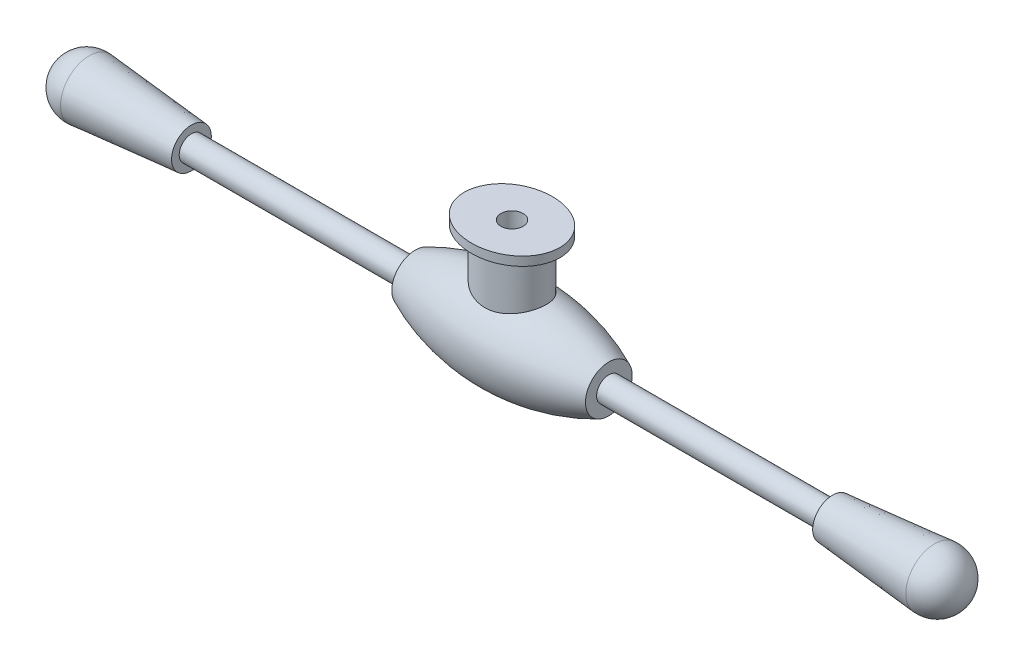
ISO-10303-21;
HEADER;
FILE_DESCRIPTION(('STEP AP214'),'2;1');
FILE_NAME('part.step','',(''),(''),'','','');
FILE_SCHEMA(('AUTOMOTIVE_DESIGN { 1 0 10303 214 1 1 1 1 }'));
ENDSEC;
DATA;
#1=APPLICATION_CONTEXT('core data for automotive mechanical design processes');
#2=APPLICATION_PROTOCOL_DEFINITION('international standard','automotive_design',2000,#1);
#3=PRODUCT_CONTEXT('',#1,'mechanical');
#4=PRODUCT('Part','Part','',(#3));
#5=PRODUCT_RELATED_PRODUCT_CATEGORY('part','',(#4));
#6=PRODUCT_DEFINITION_FORMATION('','',#4);
#7=PRODUCT_DEFINITION_CONTEXT('part definition',#1,'design');
#8=PRODUCT_DEFINITION('design','',#6,#7);
#9=PRODUCT_DEFINITION_SHAPE('','',#8);
#10=(LENGTH_UNIT() NAMED_UNIT(*) SI_UNIT(.MILLI.,.METRE.));
#11=(NAMED_UNIT(*) PLANE_ANGLE_UNIT() SI_UNIT($,.RADIAN.));
#12=(NAMED_UNIT(*) SI_UNIT($,.STERADIAN.) SOLID_ANGLE_UNIT());
#13=UNCERTAINTY_MEASURE_WITH_UNIT(LENGTH_MEASURE(1.E-05),#10,'distance_accuracy_value','');
#14=(GEOMETRIC_REPRESENTATION_CONTEXT(3) GLOBAL_UNCERTAINTY_ASSIGNED_CONTEXT((#13)) GLOBAL_UNIT_ASSIGNED_CONTEXT((#10,
#11,#12)) REPRESENTATION_CONTEXT('',''));
#15=CARTESIAN_POINT('',(0.,0.,0.));
#16=DIRECTION('',(0.,0.,1.));
#17=DIRECTION('',(1.,0.,0.));
#18=AXIS2_PLACEMENT_3D('',#15,#16,#17);
#19=CARTESIAN_POINT('',(0.,0.,0.));
#20=DIRECTION('',(1.,0.,0.));
#21=DIRECTION('',(0.,0.,-1.));
#22=AXIS2_PLACEMENT_3D('',#19,#20,#21);
#23=DEGENERATE_TOROIDAL_SURFACE('',#22,10.7114473684211,13.2514473684211,.F.);
#24=CARTESIAN_POINT('',(5.5245,0.,0.));
#25=DIRECTION('',(1.,0.,0.));
#26=DIRECTION('',(0.,0.,-1.));
#27=AXIS2_PLACEMENT_3D('',#24,#25,#26);
#28=CIRCLE('',#27,1.3335);
#29=CARTESIAN_POINT('',(5.5245,0.,-1.3335));
#30=VERTEX_POINT('',#29);
#31=EDGE_CURVE('E75',#30,#30,#28,.T.);
#32=ORIENTED_EDGE('',*,*,#31,.F.);
#33=EDGE_LOOP('',(#32));
#34=FACE_BOUND('',#33,.T.);
#35=CARTESIAN_POINT('',(-5.52449999999999,0.,0.));
#36=DIRECTION('',(1.,0.,0.));
#37=DIRECTION('',(0.,0.,-1.));
#38=AXIS2_PLACEMENT_3D('',#35,#36,#37);
#39=CIRCLE('',#38,1.3335);
#40=CARTESIAN_POINT('',(-5.52449999999999,0.,-1.3335));
#41=VERTEX_POINT('',#40);
#42=EDGE_CURVE('E79',#41,#41,#39,.T.);
#43=ORIENTED_EDGE('',*,*,#42,.T.);
#44=EDGE_LOOP('',(#43));
#45=FACE_BOUND('',#44,.T.);
#46=CARTESIAN_POINT('',(-1.9685,2.39297421774724,0.));
#47=CARTESIAN_POINT('',(-1.96849995980044,2.39297421058853,-0.0337278544221725));
#48=CARTESIAN_POINT('',(-1.96708617457117,2.39247147451063,-0.0674542473270021));
#49=CARTESIAN_POINT('',(-1.9614622226903,2.39047700589575,-0.134651485480599));
#50=CARTESIAN_POINT('',(-1.95725077653958,2.38898482083879,-0.168122206711003));
#51=CARTESIAN_POINT('',(-1.94052433260572,2.38308004571611,-0.267693577728864));
#52=CARTESIAN_POINT('',(-1.92391688537091,2.37723904322142,-0.333064814808142));
#53=CARTESIAN_POINT('',(-1.88083429926706,2.36232574891557,-0.460093884173333));
#54=CARTESIAN_POINT('',(-1.85434705873547,2.35324949488378,-0.521747054199997));
#55=CARTESIAN_POINT('',(-1.80451649271205,2.33655098539994,-0.617868253374601));
#56=CARTESIAN_POINT('',(-1.78374283474482,2.32966747079554,-0.653833471700946));
#57=CARTESIAN_POINT('',(-1.73928284787085,2.31516648202458,-0.723697717656109));
#58=CARTESIAN_POINT('',(-1.71559972000976,2.30754981644551,-0.757598955746229));
#59=CARTESIAN_POINT('',(-1.64068060105917,2.28389791576877,-0.85605557486414));
#60=CARTESIAN_POINT('',(-1.58552333194977,2.26704304517566,-0.917460570107732));
#61=CARTESIAN_POINT('',(-1.45037099355761,2.22778457308915,-1.04754339518927));
#62=CARTESIAN_POINT('',(-1.36775487423683,2.20515462463453,-1.1134026377673));
#63=CARTESIAN_POINT('',(-1.19279776060712,2.16139053839802,-1.23082233100203));
#64=CARTESIAN_POINT('',(-1.10046425477075,2.14025526947645,-1.28239368254845));
#65=CARTESIAN_POINT('',(-0.908661709954638,2.10163845169362,-1.37160656846143));
#66=CARTESIAN_POINT('',(-0.809195163724849,2.08415563470481,-1.409252941076));
#67=CARTESIAN_POINT('',(-0.60534123534552,2.05462189093183,-1.47077217832697));
#68=CARTESIAN_POINT('',(-0.500954369603968,2.04257039550386,-1.49464648493255));
#69=CARTESIAN_POINT('',(-0.289413284786048,2.02518077418633,-1.52862585543664));
#70=CARTESIAN_POINT('',(-0.182259060096245,2.01984266191559,-1.53873089140271));
#71=CARTESIAN_POINT('',(0.0325779326380007,2.01647484362719,-1.54513789943809));
#72=CARTESIAN_POINT('',(0.140260706193717,2.01844521397875,-1.54143972727224));
#73=CARTESIAN_POINT('',(0.35388821004992,2.02947262732526,-1.52025489671307));
#74=CARTESIAN_POINT('',(0.459832964404956,2.03852957215591,-1.50276842931728));
#75=CARTESIAN_POINT('',(0.667791079667733,2.06274192839537,-1.45403951626892));
#76=CARTESIAN_POINT('',(0.769804400440387,2.07789740204456,-1.42279693022378));
#77=CARTESIAN_POINT('',(0.967746347693821,2.1127364411216,-1.34648578426735));
#78=CARTESIAN_POINT('',(1.06367410799358,2.13242064930498,-1.30141526147754));
#79=CARTESIAN_POINT('',(1.24707678766415,2.17432584773466,-1.19720333452113));
#80=CARTESIAN_POINT('',(1.33454816629509,2.19654789216715,-1.13805607190981));
#81=CARTESIAN_POINT('',(1.48986341163242,2.23892181484122,-1.01192490527504));
#82=CARTESIAN_POINT('',(1.55879331683017,2.2590606163801,-0.946298416859666));
#83=CARTESIAN_POINT('',(1.64878029355964,2.28652884030143,-0.84383298751635));
#84=CARTESIAN_POINT('',(1.6749232430916,2.29468063529952,-0.81161532943599));
#85=CARTESIAN_POINT('',(1.72456024576486,2.31041879986245,-0.745011304544688));
#86=CARTESIAN_POINT('',(1.74805136651575,2.31800454040387,-0.710622601237624));
#87=CARTESIAN_POINT('',(1.80959790026821,2.33815446125873,-0.611472681513492));
#88=CARTESIAN_POINT('',(1.84430479339947,2.34985720449234,-0.544385451815942));
#89=CARTESIAN_POINT('',(1.90187973674695,2.3695522043993,-0.404736465295441));
#90=CARTESIAN_POINT('',(1.92474769516554,2.37754443230173,-0.332174666028354));
#91=CARTESIAN_POINT('',(1.95622855946788,2.38860856868364,-0.186607663925417));
#92=CARTESIAN_POINT('',(1.96536545321113,2.39186118607454,-0.113731506126564));
#93=CARTESIAN_POINT('',(1.9702705036607,2.39360274544966,0.0325010316148176));
#94=CARTESIAN_POINT('',(1.96604690939953,2.39209462680872,0.105857087346386));
#95=CARTESIAN_POINT('',(1.94588692970215,2.38497038725859,0.24193251393269));
#96=CARTESIAN_POINT('',(1.93136967206009,2.37985235622239,0.30489683958973));
#97=CARTESIAN_POINT('',(1.89312125756686,2.36655946129577,0.427608720305662));
#98=CARTESIAN_POINT('',(1.86938722268862,2.35838364261131,0.487355263939065));
#99=CARTESIAN_POINT('',(1.81207365883933,2.33903097360992,0.606374436448141));
#100=CARTESIAN_POINT('',(1.77794646075441,2.32769131068239,0.665353968595428));
#101=CARTESIAN_POINT('',(1.70205151135505,2.30317638699397,0.777816804949466));
#102=CARTESIAN_POINT('',(1.66027341276463,2.28999864619212,0.831292510773751));
#103=CARTESIAN_POINT('',(1.58209249846986,2.26620589678867,0.919293969395882));
#104=CARTESIAN_POINT('',(1.54709200377991,2.25580902097377,0.955144851009291));
#105=CARTESIAN_POINT('',(1.47415568921129,2.23480256002684,1.0235714551123));
#106=CARTESIAN_POINT('',(1.43622236230663,2.22419316110691,1.05614990623571));
#107=CARTESIAN_POINT('',(1.31864879606383,2.19248893767847,1.14898641036101));
#108=CARTESIAN_POINT('',(1.2351410649133,2.17148857013986,1.20444870921247));
#109=CARTESIAN_POINT('',(1.05973442490906,2.13164156165052,1.30314419132101));
#110=CARTESIAN_POINT('',(0.967762886387117,2.11281744545305,1.34625531301705));
#111=CARTESIAN_POINT('',(0.778147083365579,2.07929107415576,1.41979502293557));
#112=CARTESIAN_POINT('',(0.680500554224173,2.06459047839819,1.45021850792751));
#113=CARTESIAN_POINT('',(0.46413693521431,2.0386623847649,1.50260369839061));
#114=CARTESIAN_POINT('',(0.344706977402078,2.02848232485811,1.52217629174266));
#115=CARTESIAN_POINT('',(0.103858323381694,2.01719013510593,1.54382737309018));
#116=CARTESIAN_POINT('',(-0.0175604128861463,2.01607818814389,1.54590550826195));
#117=CARTESIAN_POINT('',(-0.259162659517986,2.02307554346959,1.53256180739249));
#118=CARTESIAN_POINT('',(-0.379346180844733,2.03118476384642,1.51714012680075));
#119=CARTESIAN_POINT('',(-0.615308988387039,2.05549333018357,1.46884551695306));
#120=CARTESIAN_POINT('',(-0.731088285435693,2.07169265624323,1.43597263062492));
#121=CARTESIAN_POINT('',(-0.953383069651349,2.10973191294305,1.3533888431375));
#122=CARTESIAN_POINT('',(-1.06001565744238,2.13147907744007,1.30395102841176));
#123=CARTESIAN_POINT('',(-1.25434986297333,2.176090750289,1.19262507367203));
#124=CARTESIAN_POINT('',(-1.34288886814806,2.19870981878752,1.13212347340611));
#125=CARTESIAN_POINT('',(-1.4616451412769,2.23128288002586,1.03440077451665));
#126=CARTESIAN_POINT('',(-1.49679189830328,2.24124688113069,1.00307758986892));
#127=CARTESIAN_POINT('',(-1.56443808163149,2.26094316359785,0.937512111494816));
#128=CARTESIAN_POINT('',(-1.59693322928243,2.27067505319323,0.903265275461994));
#129=CARTESIAN_POINT('',(-1.68283484419029,2.2969819281395,0.804226705737639));
#130=CARTESIAN_POINT('',(-1.73292617303056,2.31301397371661,0.736335252921858));
#131=CARTESIAN_POINT('',(-1.82054738856252,2.34178451280391,0.592272833225591));
#132=CARTESIAN_POINT('',(-1.85810551860787,2.35453039666994,0.516121001625509));
#133=CARTESIAN_POINT('',(-1.90079714341745,2.36922500597419,0.402782149903723));
#134=CARTESIAN_POINT('',(-1.91220657549659,2.37318572814373,0.368142876559502));
#135=CARTESIAN_POINT('',(-1.93200530247289,2.38009347690439,0.297918720549169));
#136=CARTESIAN_POINT('',(-1.94039610959524,2.38304101103413,0.26233432097957));
#137=CARTESIAN_POINT('',(-1.95424230983003,2.38791966931344,0.189166881253103));
#138=CARTESIAN_POINT('',(-1.95957850867997,2.38980946460466,0.151558447490957));
#139=CARTESIAN_POINT('',(-1.96670720985882,2.39233668399539,0.0759660342403854));
#140=CARTESIAN_POINT('',(-1.9685000452701,2.3929742258089,0.037982090387948));
#141=CARTESIAN_POINT('',(-1.9685,2.39297421774724,0.));
#142=B_SPLINE_CURVE_WITH_KNOTS('',3,(#46,#47,#48,#49,#50,#51,#52,#53,#54,#55,#56,#57,#58,#59,
#60,#61,#62,#63,#64,#65,#66,#67,#68,#69,#70,#71,#72,#73,#74,#75,#76,#77,#78,#79,#80,#81,#82,#83,
#84,#85,#86,#87,#88,#89,#90,#91,#92,#93,#94,#95,#96,#97,#98,#99,#100,#101,#102,#103,#104,#105,
#106,#107,#108,#109,#110,#111,#112,#113,#114,#115,#116,#117,#118,#119,#120,#121,#122,#123,#124,
#125,#126,#127,#128,#129,#130,#131,#132,#133,#134,#135,#136,#137,#138,#139,#140,#141),
.UNSPECIFIED.,.T.,.F.,(4,2,2,2,2,2,2,2,2,2,2,2,2,2,2,2,2,2,2,2,2,2,2,2,2,2,2,2,2,2,2,2,2,2,2,2,
2,2,2,2,2,2,2,2,2,2,2,4),(0.,0.101144597303681,0.202335484563735,0.404387732531978,
0.606688289432301,0.732838033599904,0.858850208308876,1.11054572335763,1.43309371226908,
1.75539493251455,2.07758406344989,2.3997394542653,2.72189549860651,3.0440549092926,
3.36620985745695,3.6883680935552,4.01057208125717,4.33291039873565,4.62330613569295,
4.75003469826162,4.87690205215277,5.10507362816147,5.33324697335782,5.5524698880465,
5.77155747654751,5.96516857559904,6.15884018024879,6.3653302561279,6.57210168502626,
6.72542110531561,6.87861160392512,7.18457018179873,7.49345561876541,7.80246517631098,
8.16517198613238,8.52788611091326,8.89059701375828,9.25330702438354,9.61030976732246,
9.93746408861283,10.0816940635811,10.226152346887,10.4825854775312,10.7384367753385,
10.8483675424376,10.9582431611382,11.072156259939,11.1860586501994),.UNSPECIFIED.);
#143=CARTESIAN_POINT('',(-1.9685,2.39297421774724,0.));
#144=VERTEX_POINT('',#143);
#145=EDGE_CURVE('E50',#144,#144,#142,.T.);
#146=ORIENTED_EDGE('',*,*,#145,.T.);
#147=EDGE_LOOP('',(#146));
#148=FACE_BOUND('',#147,.T.);
#149=ADVANCED_FACE('F46',(#34,#45,#148),#23,.F.);
#150=CARTESIAN_POINT('',(-24.257,0.,0.));
#151=DIRECTION('',(1.,0.,0.));
#152=DIRECTION('',(0.,0.,-1.));
#153=AXIS2_PLACEMENT_3D('',#150,#151,#152);
#154=SPHERICAL_SURFACE('',#153,1.651);
#155=CARTESIAN_POINT('',(-24.1131058687236,0.,0.));
#156=DIRECTION('',(1.,0.,0.));
#157=DIRECTION('',(0.,0.,-1.));
#158=AXIS2_PLACEMENT_3D('',#155,#156,#157);
#159=CIRCLE('',#158,1.64471744654947);
#160=CARTESIAN_POINT('',(-24.1131058687236,0.,-1.64471744654947));
#161=VERTEX_POINT('',#160);
#162=EDGE_CURVE('E93',#161,#161,#159,.T.);
#163=ORIENTED_EDGE('',*,*,#162,.F.);
#164=EDGE_LOOP('',(#163));
#165=FACE_BOUND('',#164,.T.);
#166=ADVANCED_FACE('F48',(#165),#154,.T.);
#167=CARTESIAN_POINT('',(24.257,0.,0.));
#168=DIRECTION('',(1.,0.,0.));
#169=DIRECTION('',(0.,0.,1.));
#170=AXIS2_PLACEMENT_3D('',#167,#168,#169);
#171=SPHERICAL_SURFACE('',#170,1.651);
#172=CARTESIAN_POINT('',(24.1131058687236,0.,0.));
#173=DIRECTION('',(1.,0.,0.));
#174=DIRECTION('',(0.,0.,-1.));
#175=AXIS2_PLACEMENT_3D('',#172,#173,#174);
#176=CIRCLE('',#175,1.64471744654948);
#177=CARTESIAN_POINT('',(24.1131058687236,0.,-1.64471744654948));
#178=VERTEX_POINT('',#177);
#179=EDGE_CURVE('E10',#178,#178,#176,.T.);
#180=ORIENTED_EDGE('',*,*,#179,.T.);
#181=EDGE_LOOP('',(#180));
#182=FACE_BOUND('',#181,.T.);
#183=ADVANCED_FACE('F147',(#182),#171,.T.);
#184=CARTESIAN_POINT('',(24.1131058687236,0.,0.));
#185=DIRECTION('',(1.,0.,0.));
#186=DIRECTION('',(0.,0.,-1.));
#187=AXIS2_PLACEMENT_3D('',#184,#185,#186);
#188=CONICAL_SURFACE('',#187,1.64471744654948,0.0872664625997167);
#189=CARTESIAN_POINT('',(18.288,0.,0.));
#190=DIRECTION('',(1.,0.,0.));
#191=DIRECTION('',(0.,0.,-1.));
#192=AXIS2_PLACEMENT_3D('',#189,#190,#191);
#193=CIRCLE('',#192,1.13508671919783);
#194=CARTESIAN_POINT('',(18.288,0.,-1.13508671919783));
#195=VERTEX_POINT('',#194);
#196=EDGE_CURVE('E60',#195,#195,#193,.T.);
#197=ORIENTED_EDGE('',*,*,#196,.T.);
#198=EDGE_LOOP('',(#197));
#199=FACE_BOUND('',#198,.T.);
#200=ORIENTED_EDGE('',*,*,#179,.F.);
#201=EDGE_LOOP('',(#200));
#202=FACE_BOUND('',#201,.T.);
#203=ADVANCED_FACE('F144',(#199,#202),#188,.T.);
#204=CARTESIAN_POINT('',(18.288,0.,-1.13508671919783));
#205=DIRECTION('',(-1.,0.,0.));
#206=DIRECTION('',(0.,0.,1.));
#207=AXIS2_PLACEMENT_3D('',#204,#205,#206);
#208=PLANE('',#207);
#209=CARTESIAN_POINT('',(18.288,0.,0.));
#210=DIRECTION('',(1.,0.,0.));
#211=DIRECTION('',(0.,0.,-1.));
#212=AXIS2_PLACEMENT_3D('',#209,#210,#211);
#213=CIRCLE('',#212,0.698500000000004);
#214=CARTESIAN_POINT('',(18.288,0.,-0.698500000000004));
#215=VERTEX_POINT('',#214);
#216=EDGE_CURVE('E66',#215,#215,#213,.T.);
#217=ORIENTED_EDGE('',*,*,#216,.T.);
#218=EDGE_LOOP('',(#217));
#219=FACE_BOUND('',#218,.T.);
#220=ORIENTED_EDGE('',*,*,#196,.F.);
#221=EDGE_LOOP('',(#220));
#222=FACE_BOUND('',#221,.T.);
#223=ADVANCED_FACE('F140',(#219,#222),#208,.T.);
#224=CARTESIAN_POINT('',(25.908,0.,0.));
#225=DIRECTION('',(1.,0.,0.));
#226=DIRECTION('',(0.,0.,-1.));
#227=AXIS2_PLACEMENT_3D('',#224,#225,#226);
#228=CYLINDRICAL_SURFACE('',#227,0.698500000000004);
#229=CARTESIAN_POINT('',(5.5245,0.,0.));
#230=DIRECTION('',(1.,0.,0.));
#231=DIRECTION('',(0.,0.,-1.));
#232=AXIS2_PLACEMENT_3D('',#229,#230,#231);
#233=CIRCLE('',#232,0.698500000000003);
#234=CARTESIAN_POINT('',(5.5245,0.,-0.698500000000003));
#235=VERTEX_POINT('',#234);
#236=EDGE_CURVE('E71',#235,#235,#233,.T.);
#237=ORIENTED_EDGE('',*,*,#236,.T.);
#238=EDGE_LOOP('',(#237));
#239=FACE_BOUND('',#238,.T.);
#240=ORIENTED_EDGE('',*,*,#216,.F.);
#241=EDGE_LOOP('',(#240));
#242=FACE_BOUND('',#241,.T.);
#243=ADVANCED_FACE('F136',(#239,#242),#228,.T.);
#244=CARTESIAN_POINT('',(5.5245,0.,-0.698500000000003));
#245=DIRECTION('',(1.,0.,0.));
#246=DIRECTION('',(0.,0.,-1.));
#247=AXIS2_PLACEMENT_3D('',#244,#245,#246);
#248=PLANE('',#247);
#249=ORIENTED_EDGE('',*,*,#31,.T.);
#250=EDGE_LOOP('',(#249));
#251=FACE_BOUND('',#250,.T.);
#252=ORIENTED_EDGE('',*,*,#236,.F.);
#253=EDGE_LOOP('',(#252));
#254=FACE_BOUND('',#253,.T.);
#255=ADVANCED_FACE('F128',(#251,#254),#248,.T.);
#256=CARTESIAN_POINT('',(-5.5245,0.,-0.698500000000002));
#257=DIRECTION('',(-1.,0.,0.));
#258=DIRECTION('',(0.,0.,1.));
#259=AXIS2_PLACEMENT_3D('',#256,#257,#258);
#260=PLANE('',#259);
#261=CARTESIAN_POINT('',(-5.5245,0.,0.));
#262=DIRECTION('',(1.,0.,0.));
#263=DIRECTION('',(0.,0.,-1.));
#264=AXIS2_PLACEMENT_3D('',#261,#262,#263);
#265=CIRCLE('',#264,0.698500000000002);
#266=CARTESIAN_POINT('',(-5.5245,0.,-0.698500000000002));
#267=VERTEX_POINT('',#266);
#268=EDGE_CURVE('E83',#267,#267,#265,.T.);
#269=ORIENTED_EDGE('',*,*,#268,.T.);
#270=EDGE_LOOP('',(#269));
#271=FACE_BOUND('',#270,.T.);
#272=ORIENTED_EDGE('',*,*,#42,.F.);
#273=EDGE_LOOP('',(#272));
#274=FACE_BOUND('',#273,.T.);
#275=ADVANCED_FACE('F125',(#271,#274),#260,.T.);
#276=CARTESIAN_POINT('',(25.908,0.,0.));
#277=DIRECTION('',(1.,0.,0.));
#278=DIRECTION('',(0.,0.,-1.));
#279=AXIS2_PLACEMENT_3D('',#276,#277,#278);
#280=CYLINDRICAL_SURFACE('',#279,0.698500000000001);
#281=CARTESIAN_POINT('',(-18.288,0.,0.));
#282=DIRECTION('',(1.,0.,0.));
#283=DIRECTION('',(0.,0.,-1.));
#284=AXIS2_PLACEMENT_3D('',#281,#282,#283);
#285=CIRCLE('',#284,0.6985);
#286=CARTESIAN_POINT('',(-18.288,0.,-0.6985));
#287=VERTEX_POINT('',#286);
#288=EDGE_CURVE('E87',#287,#287,#285,.T.);
#289=ORIENTED_EDGE('',*,*,#288,.T.);
#290=EDGE_LOOP('',(#289));
#291=FACE_BOUND('',#290,.T.);
#292=ORIENTED_EDGE('',*,*,#268,.F.);
#293=EDGE_LOOP('',(#292));
#294=FACE_BOUND('',#293,.T.);
#295=ADVANCED_FACE('F121',(#291,#294),#280,.T.);
#296=CARTESIAN_POINT('',(-18.288,0.,-1.13508671919783));
#297=DIRECTION('',(1.,0.,0.));
#298=DIRECTION('',(0.,0.,-1.));
#299=AXIS2_PLACEMENT_3D('',#296,#297,#298);
#300=PLANE('',#299);
#301=CARTESIAN_POINT('',(-18.288,0.,0.));
#302=DIRECTION('',(1.,0.,0.));
#303=DIRECTION('',(0.,0.,-1.));
#304=AXIS2_PLACEMENT_3D('',#301,#302,#303);
#305=CIRCLE('',#304,1.13508671919783);
#306=CARTESIAN_POINT('',(-18.288,0.,-1.13508671919783));
#307=VERTEX_POINT('',#306);
#308=EDGE_CURVE('E90',#307,#307,#305,.T.);
#309=ORIENTED_EDGE('',*,*,#308,.T.);
#310=EDGE_LOOP('',(#309));
#311=FACE_BOUND('',#310,.T.);
#312=ORIENTED_EDGE('',*,*,#288,.F.);
#313=EDGE_LOOP('',(#312));
#314=FACE_BOUND('',#313,.T.);
#315=ADVANCED_FACE('F117',(#311,#314),#300,.T.);
#316=CARTESIAN_POINT('',(-18.288,0.,0.));
#317=DIRECTION('',(-1.,0.,0.));
#318=DIRECTION('',(0.,0.,1.));
#319=AXIS2_PLACEMENT_3D('',#316,#317,#318);
#320=CONICAL_SURFACE('',#319,1.13508671919783,0.0872664625997165);
#321=ORIENTED_EDGE('',*,*,#162,.T.);
#322=EDGE_LOOP('',(#321));
#323=FACE_BOUND('',#322,.T.);
#324=ORIENTED_EDGE('',*,*,#308,.F.);
#325=EDGE_LOOP('',(#324));
#326=FACE_BOUND('',#325,.T.);
#327=ADVANCED_FACE('F112',(#323,#326),#320,.T.);
#328=CARTESIAN_POINT('',(0.,5.08,0.));
#329=DIRECTION('',(0.,1.,0.));
#330=DIRECTION('',(-1.,0.,0.));
#331=AXIS2_PLACEMENT_3D('',#328,#329,#330);
#332=ELLIPSE('',#331,1.9685,1.54305);
#333=DIRECTION('',(0.,-1.,0.));
#334=VECTOR('',#333,1.);
#335=SURFACE_OF_LINEAR_EXTRUSION('',#332,#334);
#336=ORIENTED_EDGE('',*,*,#145,.F.);
#337=EDGE_LOOP('',(#336));
#338=FACE_BOUND('',#337,.T.);
#339=CARTESIAN_POINT('',(-1.9685,5.08,0.));
#340=VERTEX_POINT('',#339);
#341=EDGE_CURVE('E96',#340,#340,#332,.T.);
#342=ORIENTED_EDGE('',*,*,#341,.F.);
#343=EDGE_LOOP('',(#342));
#344=FACE_BOUND('',#343,.T.);
#345=ADVANCED_FACE('F106',(#338,#344),#335,.F.);
#346=CARTESIAN_POINT('',(-2.7305,5.588,0.));
#347=CARTESIAN_POINT('',(-2.7305,5.588,0.328264154945126));
#348=CARTESIAN_POINT('',(-2.5592940626462,5.588,0.984792464835377));
#349=CARTESIAN_POINT('',(-1.68156315501589,5.588,1.99157673247306));
#350=CARTESIAN_POINT('',(0.,5.588,2.51403217835129));
#351=CARTESIAN_POINT('',(1.68156315501589,5.588,1.99157673247306));
#352=CARTESIAN_POINT('',(2.5592940626462,5.588,0.984792464835377));
#353=CARTESIAN_POINT('',(2.8161029686769,5.588,0.));
#354=CARTESIAN_POINT('',(2.5592940626462,5.588,-0.984792464835377));
#355=CARTESIAN_POINT('',(1.68156315501589,5.588,-1.99157673247306));
#356=CARTESIAN_POINT('',(0.,5.588,-2.51403217835129));
#357=CARTESIAN_POINT('',(-1.68156315501589,5.588,-1.99157673247306));
#358=CARTESIAN_POINT('',(-2.5592940626462,5.588,-0.984792464835379));
#359=CARTESIAN_POINT('',(-2.7305,5.588,-0.328264154945127));
#360=CARTESIAN_POINT('',(-2.7305,5.588,0.));
#361=B_SPLINE_CURVE_WITH_KNOTS('',3,(#346,#347,#348,#349,#350,#351,#352,#353,#354,#355,#356,
#357,#358,#359,#360),.UNSPECIFIED.,.T.,.F.,(4,1,1,1,1,1,1,1,1,1,1,1,4),(0.,0.392699081698724,
0.785398163397448,1.5707963267949,2.35619449019234,2.74889357189107,3.14159265358979,
3.53429173528852,3.92699081698724,4.71238898038469,5.49778714378214,5.89048622548086,
6.28318530717959),.UNSPECIFIED.);
#362=DIRECTION('',(0.,-1.,0.));
#363=VECTOR('',#362,1.);
#364=SURFACE_OF_LINEAR_EXTRUSION('',#361,#363);
#365=CARTESIAN_POINT('',(-2.7305,5.588,0.));
#366=VERTEX_POINT('',#365);
#367=EDGE_CURVE('E101',#366,#366,#361,.T.);
#368=ORIENTED_EDGE('',*,*,#367,.F.);
#369=EDGE_LOOP('',(#368));
#370=FACE_BOUND('',#369,.T.);
#371=CARTESIAN_POINT('',(-2.7305,5.08,0.));
#372=CARTESIAN_POINT('',(-2.7305,5.08,0.328264154945126));
#373=CARTESIAN_POINT('',(-2.5592940626462,5.08,0.984792464835377));
#374=CARTESIAN_POINT('',(-1.68156315501589,5.08,1.99157673247306));
#375=CARTESIAN_POINT('',(0.,5.08,2.51403217835129));
#376=CARTESIAN_POINT('',(1.68156315501589,5.08,1.99157673247306));
#377=CARTESIAN_POINT('',(2.5592940626462,5.08,0.984792464835377));
#378=CARTESIAN_POINT('',(2.8161029686769,5.08,0.));
#379=CARTESIAN_POINT('',(2.5592940626462,5.08,-0.984792464835377));
#380=CARTESIAN_POINT('',(1.68156315501589,5.08,-1.99157673247306));
#381=CARTESIAN_POINT('',(0.,5.08,-2.51403217835129));
#382=CARTESIAN_POINT('',(-1.68156315501589,5.08,-1.99157673247306));
#383=CARTESIAN_POINT('',(-2.5592940626462,5.08,-0.984792464835379));
#384=CARTESIAN_POINT('',(-2.7305,5.08,-0.328264154945127));
#385=CARTESIAN_POINT('',(-2.7305,5.08,0.));
#386=B_SPLINE_CURVE_WITH_KNOTS('',3,(#371,#372,#373,#374,#375,#376,#377,#378,#379,#380,#381,
#382,#383,#384,#385),.UNSPECIFIED.,.T.,.F.,(4,1,1,1,1,1,1,1,1,1,1,1,4),(0.,0.392699081698724,
0.785398163397448,1.5707963267949,2.35619449019234,2.74889357189107,3.14159265358979,
3.53429173528852,3.92699081698724,4.71238898038469,5.49778714378214,5.89048622548086,
6.28318530717959),.UNSPECIFIED.);
#387=CARTESIAN_POINT('',(-2.7305,5.08,0.));
#388=VERTEX_POINT('',#387);
#389=EDGE_CURVE('E102',#388,#388,#386,.T.);
#390=ORIENTED_EDGE('',*,*,#389,.T.);
#391=EDGE_LOOP('',(#390));
#392=FACE_BOUND('',#391,.T.);
#393=ADVANCED_FACE('F111',(#370,#392),#364,.F.);
#394=CARTESIAN_POINT('',(0.,5.588,0.));
#395=DIRECTION('',(0.,1.,0.));
#396=DIRECTION('',(0.,0.,1.));
#397=AXIS2_PLACEMENT_3D('',#394,#395,#396);
#398=PLANE('',#397);
#399=CARTESIAN_POINT('',(0.,5.588,0.));
#400=DIRECTION('',(0.,1.,0.));
#401=DIRECTION('',(0.,0.,1.));
#402=AXIS2_PLACEMENT_3D('',#399,#400,#401);
#403=CIRCLE('',#402,0.635);
#404=CARTESIAN_POINT('',(0.,5.588,0.635));
#405=VERTEX_POINT('',#404);
#406=EDGE_CURVE('E173',#405,#405,#403,.T.);
#407=ORIENTED_EDGE('',*,*,#406,.F.);
#408=EDGE_LOOP('',(#407));
#409=FACE_BOUND('',#408,.T.);
#410=ORIENTED_EDGE('',*,*,#367,.T.);
#411=EDGE_LOOP('',(#410));
#412=FACE_BOUND('',#411,.T.);
#413=ADVANCED_FACE('F201',(#409,#412),#398,.T.);
#414=CARTESIAN_POINT('',(0.,5.08,0.));
#415=DIRECTION('',(0.,1.,0.));
#416=DIRECTION('',(0.,0.,1.));
#417=AXIS2_PLACEMENT_3D('',#414,#415,#416);
#418=PLANE('',#417);
#419=ORIENTED_EDGE('',*,*,#341,.T.);
#420=EDGE_LOOP('',(#419));
#421=FACE_BOUND('',#420,.T.);
#422=ORIENTED_EDGE('',*,*,#389,.F.);
#423=EDGE_LOOP('',(#422));
#424=FACE_BOUND('',#423,.T.);
#425=ADVANCED_FACE('F194',(#421,#424),#418,.F.);
#426=CARTESIAN_POINT('',(0.,5.588,0.));
#427=DIRECTION('',(0.,-1.,0.));
#428=DIRECTION('',(0.,0.,-1.));
#429=AXIS2_PLACEMENT_3D('',#426,#427,#428);
#430=CYLINDRICAL_SURFACE('',#429,0.635);
#431=ORIENTED_EDGE('',*,*,#406,.T.);
#432=EDGE_LOOP('',(#431));
#433=FACE_BOUND('',#432,.T.);
#434=CARTESIAN_POINT('',(0.,0.,0.));
#435=DIRECTION('',(0.,1.,0.));
#436=DIRECTION('',(0.,0.,1.));
#437=AXIS2_PLACEMENT_3D('',#434,#435,#436);
#438=CIRCLE('',#437,0.635);
#439=CARTESIAN_POINT('',(0.,0.,0.635));
#440=VERTEX_POINT('',#439);
#441=EDGE_CURVE('E178',#440,#440,#438,.T.);
#442=ORIENTED_EDGE('',*,*,#441,.F.);
#443=EDGE_LOOP('',(#442));
#444=FACE_BOUND('',#443,.T.);
#445=ADVANCED_FACE('F192',(#433,#444),#430,.F.);
#446=CARTESIAN_POINT('',(0.,0.,0.));
#447=DIRECTION('',(0.,1.,0.));
#448=DIRECTION('',(0.,0.,1.));
#449=AXIS2_PLACEMENT_3D('',#446,#447,#448);
#450=PLANE('',#449);
#451=ORIENTED_EDGE('',*,*,#441,.T.);
#452=EDGE_LOOP('',(#451));
#453=FACE_BOUND('',#452,.T.);
#454=ADVANCED_FACE('F190',(#453),#450,.T.);
#455=CLOSED_SHELL('',(#149,#166,#183,#203,#223,#243,#255,#275,#295,#315,#327,#345,#393,#413,
#425,#445,#454));
#456=MANIFOLD_SOLID_BREP('B2',#455);
#457=ADVANCED_BREP_SHAPE_REPRESENTATION('',(#18,#456),#14);
#458=SHAPE_DEFINITION_REPRESENTATION(#9,#457);
ENDSEC;
END-ISO-10303-21;
